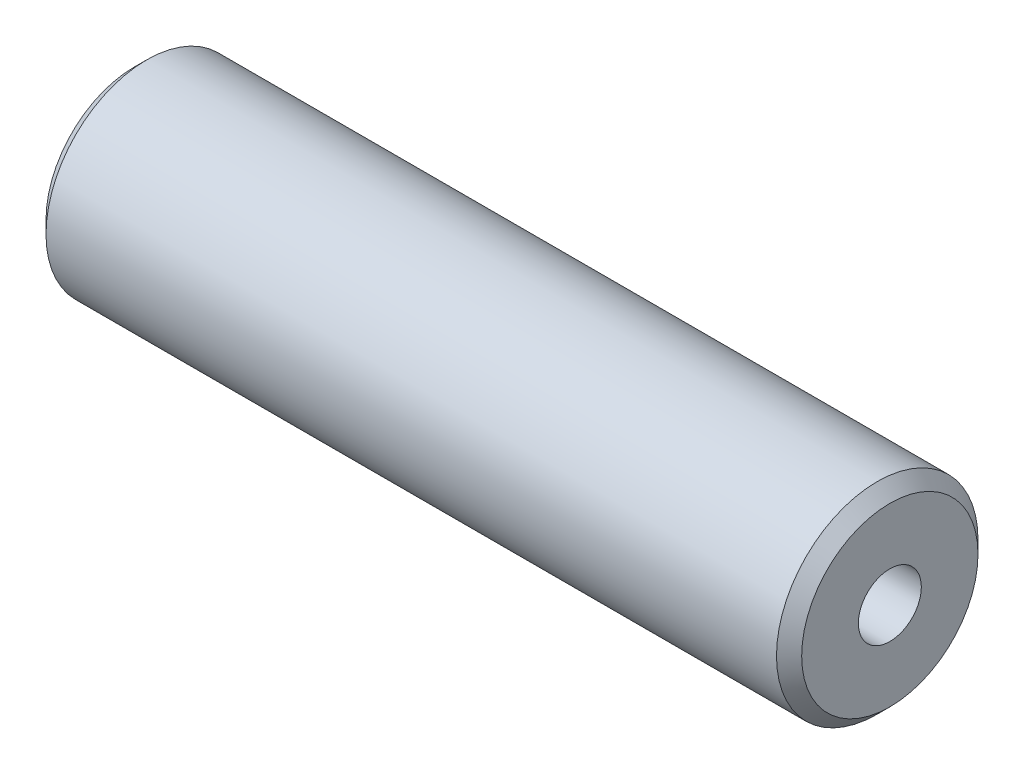
ISO-10303-21;
HEADER;
FILE_DESCRIPTION(('STEP AP214'),'2;1');
FILE_NAME('part.step','',(''),(''),'','','');
FILE_SCHEMA(('AUTOMOTIVE_DESIGN { 1 0 10303 214 1 1 1 1 }'));
ENDSEC;
DATA;
#1=APPLICATION_CONTEXT('core data for automotive mechanical design processes');
#2=APPLICATION_PROTOCOL_DEFINITION('international standard','automotive_design',2000,#1);
#3=PRODUCT_CONTEXT('',#1,'mechanical');
#4=PRODUCT('Part','Part','',(#3));
#5=PRODUCT_RELATED_PRODUCT_CATEGORY('part','',(#4));
#6=PRODUCT_DEFINITION_FORMATION('','',#4);
#7=PRODUCT_DEFINITION_CONTEXT('part definition',#1,'design');
#8=PRODUCT_DEFINITION('design','',#6,#7);
#9=PRODUCT_DEFINITION_SHAPE('','',#8);
#10=(LENGTH_UNIT() NAMED_UNIT(*) SI_UNIT(.MILLI.,.METRE.));
#11=(NAMED_UNIT(*) PLANE_ANGLE_UNIT() SI_UNIT($,.RADIAN.));
#12=(NAMED_UNIT(*) SI_UNIT($,.STERADIAN.) SOLID_ANGLE_UNIT());
#13=UNCERTAINTY_MEASURE_WITH_UNIT(LENGTH_MEASURE(1.E-05),#10,'distance_accuracy_value','');
#14=(GEOMETRIC_REPRESENTATION_CONTEXT(3) GLOBAL_UNCERTAINTY_ASSIGNED_CONTEXT((#13)) GLOBAL_UNIT_ASSIGNED_CONTEXT((#10,
#11,#12)) REPRESENTATION_CONTEXT('',''));
#15=CARTESIAN_POINT('',(0.,0.,0.));
#16=DIRECTION('',(0.,0.,1.));
#17=DIRECTION('',(1.,0.,0.));
#18=AXIS2_PLACEMENT_3D('',#15,#16,#17);
#19=CARTESIAN_POINT('',(0.,0.,0.));
#20=DIRECTION('',(1.,0.,0.));
#21=DIRECTION('',(0.,0.,-1.));
#22=AXIS2_PLACEMENT_3D('',#19,#20,#21);
#23=PLANE('',#22);
#24=CARTESIAN_POINT('',(0.,0.,0.));
#25=DIRECTION('',(1.,0.,0.));
#26=DIRECTION('',(0.,0.,-1.));
#27=AXIS2_PLACEMENT_3D('',#24,#25,#26);
#28=CIRCLE('',#27,3.5);
#29=CARTESIAN_POINT('',(0.,0.,-3.5));
#30=VERTEX_POINT('',#29);
#31=EDGE_CURVE('E73',#30,#30,#28,.F.);
#32=ORIENTED_EDGE('',*,*,#31,.T.);
#33=EDGE_LOOP('',(#32));
#34=FACE_BOUND('',#33,.T.);
#35=CARTESIAN_POINT('',(0.,0.,0.));
#36=DIRECTION('',(-1.,0.,0.));
#37=DIRECTION('',(0.,0.,1.));
#38=AXIS2_PLACEMENT_3D('',#35,#36,#37);
#39=CIRCLE('',#38,1.25);
#40=CARTESIAN_POINT('',(0.,0.,1.25));
#41=VERTEX_POINT('',#40);
#42=EDGE_CURVE('E62',#41,#41,#39,.T.);
#43=ORIENTED_EDGE('',*,*,#42,.F.);
#44=EDGE_LOOP('',(#43));
#45=FACE_BOUND('',#44,.T.);
#46=ADVANCED_FACE('F38',(#34,#45),#23,.F.);
#47=CARTESIAN_POINT('',(0.,0.,0.));
#48=DIRECTION('',(-1.,0.,0.));
#49=DIRECTION('',(0.,0.,1.));
#50=AXIS2_PLACEMENT_3D('',#47,#48,#49);
#51=CYLINDRICAL_SURFACE('',#50,4.);
#52=CARTESIAN_POINT('',(0.500000000000007,0.,0.));
#53=DIRECTION('',(1.,0.,0.));
#54=DIRECTION('',(0.,0.,-1.));
#55=AXIS2_PLACEMENT_3D('',#52,#53,#54);
#56=CIRCLE('',#55,4.);
#57=CARTESIAN_POINT('',(0.500000000000007,0.,-4.));
#58=VERTEX_POINT('',#57);
#59=EDGE_CURVE('E46',#58,#58,#56,.T.);
#60=ORIENTED_EDGE('',*,*,#59,.T.);
#61=EDGE_LOOP('',(#60));
#62=FACE_BOUND('',#61,.T.);
#63=CARTESIAN_POINT('',(29.5,0.,0.));
#64=DIRECTION('',(-1.,0.,0.));
#65=DIRECTION('',(0.,0.,1.));
#66=AXIS2_PLACEMENT_3D('',#63,#64,#65);
#67=CIRCLE('',#66,4.);
#68=CARTESIAN_POINT('',(29.5,0.,4.));
#69=VERTEX_POINT('',#68);
#70=EDGE_CURVE('E76',#69,#69,#67,.T.);
#71=ORIENTED_EDGE('',*,*,#70,.T.);
#72=EDGE_LOOP('',(#71));
#73=FACE_BOUND('',#72,.T.);
#74=ADVANCED_FACE('F81',(#62,#73),#51,.T.);
#75=CARTESIAN_POINT('',(30.,0.,0.));
#76=DIRECTION('',(-1.,0.,0.));
#77=DIRECTION('',(0.,0.,1.));
#78=AXIS2_PLACEMENT_3D('',#75,#76,#77);
#79=PLANE('',#78);
#80=CARTESIAN_POINT('',(30.,0.,0.));
#81=DIRECTION('',(-1.,0.,0.));
#82=DIRECTION('',(0.,0.,1.));
#83=AXIS2_PLACEMENT_3D('',#80,#81,#82);
#84=CIRCLE('',#83,3.5);
#85=CARTESIAN_POINT('',(30.,0.,3.5));
#86=VERTEX_POINT('',#85);
#87=EDGE_CURVE('E11',#86,#86,#84,.F.);
#88=ORIENTED_EDGE('',*,*,#87,.T.);
#89=EDGE_LOOP('',(#88));
#90=FACE_BOUND('',#89,.T.);
#91=CARTESIAN_POINT('',(30.,0.,0.));
#92=DIRECTION('',(1.,0.,0.));
#93=DIRECTION('',(0.,0.,-1.));
#94=AXIS2_PLACEMENT_3D('',#91,#92,#93);
#95=CIRCLE('',#94,1.24999999999999);
#96=CARTESIAN_POINT('',(30.,0.,-1.24999999999999));
#97=VERTEX_POINT('',#96);
#98=EDGE_CURVE('E63',#97,#97,#95,.T.);
#99=ORIENTED_EDGE('',*,*,#98,.F.);
#100=EDGE_LOOP('',(#99));
#101=FACE_BOUND('',#100,.T.);
#102=ADVANCED_FACE('F101',(#90,#101),#79,.F.);
#103=CARTESIAN_POINT('',(8.5,0.,0.));
#104=DIRECTION('',(-1.,0.,0.));
#105=DIRECTION('',(0.,0.,1.));
#106=AXIS2_PLACEMENT_3D('',#103,#104,#105);
#107=CONICAL_SURFACE('',#106,1.25,1.02974425867665);
#108=CARTESIAN_POINT('',(9.25107577378445,0.,0.));
#109=VERTEX_POINT('',#108);
#110=VERTEX_LOOP('',#109);
#111=FACE_BOUND('',#110,.T.);
#112=CARTESIAN_POINT('',(8.5,0.,0.));
#113=DIRECTION('',(-1.,0.,0.));
#114=DIRECTION('',(0.,0.,1.));
#115=AXIS2_PLACEMENT_3D('',#112,#113,#114);
#116=CIRCLE('',#115,1.25);
#117=CARTESIAN_POINT('',(8.5,0.,1.25));
#118=VERTEX_POINT('',#117);
#119=EDGE_CURVE('E66',#118,#118,#116,.T.);
#120=ORIENTED_EDGE('',*,*,#119,.T.);
#121=EDGE_LOOP('',(#120));
#122=FACE_BOUND('',#121,.T.);
#123=ADVANCED_FACE('F95',(#111,#122),#107,.F.);
#124=CARTESIAN_POINT('',(0.,0.,0.));
#125=DIRECTION('',(-1.,0.,0.));
#126=DIRECTION('',(0.,0.,1.));
#127=AXIS2_PLACEMENT_3D('',#124,#125,#126);
#128=CYLINDRICAL_SURFACE('',#127,1.25);
#129=ORIENTED_EDGE('',*,*,#119,.F.);
#130=EDGE_LOOP('',(#129));
#131=FACE_BOUND('',#130,.T.);
#132=ORIENTED_EDGE('',*,*,#42,.T.);
#133=EDGE_LOOP('',(#132));
#134=FACE_BOUND('',#133,.T.);
#135=ADVANCED_FACE('F56',(#131,#134),#128,.F.);
#136=CARTESIAN_POINT('',(21.5,0.,0.));
#137=DIRECTION('',(1.,0.,0.));
#138=DIRECTION('',(0.,0.,-1.));
#139=AXIS2_PLACEMENT_3D('',#136,#137,#138);
#140=CONICAL_SURFACE('',#139,1.24999999999999,1.02974425867665);
#141=CARTESIAN_POINT('',(20.7489242262156,0.,0.));
#142=VERTEX_POINT('',#141);
#143=VERTEX_LOOP('',#142);
#144=FACE_BOUND('',#143,.T.);
#145=CARTESIAN_POINT('',(21.5,0.,0.));
#146=DIRECTION('',(1.,0.,0.));
#147=DIRECTION('',(0.,0.,-1.));
#148=AXIS2_PLACEMENT_3D('',#145,#146,#147);
#149=CIRCLE('',#148,1.24999999999999);
#150=CARTESIAN_POINT('',(21.5,0.,-1.24999999999999));
#151=VERTEX_POINT('',#150);
#152=EDGE_CURVE('E60',#151,#151,#149,.T.);
#153=ORIENTED_EDGE('',*,*,#152,.T.);
#154=EDGE_LOOP('',(#153));
#155=FACE_BOUND('',#154,.T.);
#156=ADVANCED_FACE('F52',(#144,#155),#140,.F.);
#157=CARTESIAN_POINT('',(30.,0.,0.));
#158=DIRECTION('',(1.,0.,0.));
#159=DIRECTION('',(0.,0.,-1.));
#160=AXIS2_PLACEMENT_3D('',#157,#158,#159);
#161=CYLINDRICAL_SURFACE('',#160,1.24999999999999);
#162=ORIENTED_EDGE('',*,*,#152,.F.);
#163=EDGE_LOOP('',(#162));
#164=FACE_BOUND('',#163,.T.);
#165=ORIENTED_EDGE('',*,*,#98,.T.);
#166=EDGE_LOOP('',(#165));
#167=FACE_BOUND('',#166,.T.);
#168=ADVANCED_FACE('F55',(#164,#167),#161,.F.);
#169=CARTESIAN_POINT('',(0.,0.,0.));
#170=DIRECTION('',(1.,0.,0.));
#171=DIRECTION('',(0.,0.,-1.));
#172=AXIS2_PLACEMENT_3D('',#169,#170,#171);
#173=CONICAL_SURFACE('',#172,3.5,0.785398163397441);
#174=ORIENTED_EDGE('',*,*,#59,.F.);
#175=EDGE_LOOP('',(#174));
#176=FACE_BOUND('',#175,.T.);
#177=ORIENTED_EDGE('',*,*,#31,.F.);
#178=EDGE_LOOP('',(#177));
#179=FACE_BOUND('',#178,.T.);
#180=ADVANCED_FACE('F84',(#176,#179),#173,.T.);
#181=CARTESIAN_POINT('',(29.5,0.,0.));
#182=DIRECTION('',(-1.,0.,0.));
#183=DIRECTION('',(0.,0.,1.));
#184=AXIS2_PLACEMENT_3D('',#181,#182,#183);
#185=CONICAL_SURFACE('',#184,4.,0.785398163397455);
#186=ORIENTED_EDGE('',*,*,#87,.F.);
#187=EDGE_LOOP('',(#186));
#188=FACE_BOUND('',#187,.T.);
#189=ORIENTED_EDGE('',*,*,#70,.F.);
#190=EDGE_LOOP('',(#189));
#191=FACE_BOUND('',#190,.T.);
#192=ADVANCED_FACE('F40',(#188,#191),#185,.T.);
#193=CLOSED_SHELL('',(#46,#74,#102,#123,#135,#156,#168,#180,#192));
#194=MANIFOLD_SOLID_BREP('B2',#193);
#195=ADVANCED_BREP_SHAPE_REPRESENTATION('',(#18,#194),#14);
#196=SHAPE_DEFINITION_REPRESENTATION(#9,#195);
ENDSEC;
END-ISO-10303-21;
